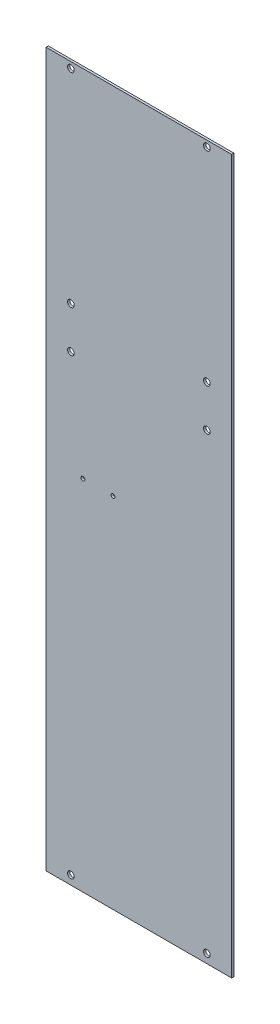
ISO-10303-21;
HEADER;
FILE_DESCRIPTION(('STEP AP214'),'2;1');
FILE_NAME('part.step','',(''),(''),'','','');
FILE_SCHEMA(('AUTOMOTIVE_DESIGN { 1 0 10303 214 1 1 1 1 }'));
ENDSEC;
DATA;
#1=APPLICATION_CONTEXT('core data for automotive mechanical design processes');
#2=APPLICATION_PROTOCOL_DEFINITION('international standard','automotive_design',2000,#1);
#3=PRODUCT_CONTEXT('',#1,'mechanical');
#4=PRODUCT('Part','Part','',(#3));
#5=PRODUCT_RELATED_PRODUCT_CATEGORY('part','',(#4));
#6=PRODUCT_DEFINITION_FORMATION('','',#4);
#7=PRODUCT_DEFINITION_CONTEXT('part definition',#1,'design');
#8=PRODUCT_DEFINITION('design','',#6,#7);
#9=PRODUCT_DEFINITION_SHAPE('','',#8);
#10=(LENGTH_UNIT() NAMED_UNIT(*) SI_UNIT(.MILLI.,.METRE.));
#11=(NAMED_UNIT(*) PLANE_ANGLE_UNIT() SI_UNIT($,.RADIAN.));
#12=(NAMED_UNIT(*) SI_UNIT($,.STERADIAN.) SOLID_ANGLE_UNIT());
#13=UNCERTAINTY_MEASURE_WITH_UNIT(LENGTH_MEASURE(1.E-05),#10,'distance_accuracy_value','');
#14=(GEOMETRIC_REPRESENTATION_CONTEXT(3) GLOBAL_UNCERTAINTY_ASSIGNED_CONTEXT((#13)) GLOBAL_UNIT_ASSIGNED_CONTEXT((#10,
#11,#12)) REPRESENTATION_CONTEXT('',''));
#15=CARTESIAN_POINT('',(0.,0.,0.));
#16=DIRECTION('',(0.,0.,1.));
#17=DIRECTION('',(1.,0.,0.));
#18=AXIS2_PLACEMENT_3D('',#15,#16,#17);
#19=CARTESIAN_POINT('',(-41.6,-160.,1.));
#20=DIRECTION('',(1.,0.,0.));
#21=DIRECTION('',(0.,0.,-1.));
#22=AXIS2_PLACEMENT_3D('',#19,#20,#21);
#23=PLANE('',#22);
#24=DIRECTION('',(0.,-1.,0.));
#25=VECTOR('',#24,1.);
#26=CARTESIAN_POINT('',(-41.6,-160.,0.));
#27=LINE('',#26,#25);
#28=CARTESIAN_POINT('',(-41.6,160.,0.));
#29=VERTEX_POINT('',#28);
#30=CARTESIAN_POINT('',(-41.6,-160.,0.));
#31=VERTEX_POINT('',#30);
#32=EDGE_CURVE('E100',#29,#31,#27,.T.);
#33=ORIENTED_EDGE('',*,*,#32,.T.);
#34=DIRECTION('',(0.,0.,-1.));
#35=VECTOR('',#34,1.);
#36=CARTESIAN_POINT('',(-41.6,-160.,1.));
#37=LINE('',#36,#35);
#38=CARTESIAN_POINT('',(-41.6,-160.,1.));
#39=VERTEX_POINT('',#38);
#40=EDGE_CURVE('E11',#39,#31,#37,.T.);
#41=ORIENTED_EDGE('',*,*,#40,.F.);
#42=DIRECTION('',(0.,-1.,0.));
#43=VECTOR('',#42,1.);
#44=CARTESIAN_POINT('',(-41.6,-160.,1.));
#45=LINE('',#44,#43);
#46=CARTESIAN_POINT('',(-41.6,160.,1.));
#47=VERTEX_POINT('',#46);
#48=EDGE_CURVE('E88',#47,#39,#45,.T.);
#49=ORIENTED_EDGE('',*,*,#48,.F.);
#50=DIRECTION('',(0.,0.,-1.));
#51=VECTOR('',#50,1.);
#52=CARTESIAN_POINT('',(-41.6,160.,1.));
#53=LINE('',#52,#51);
#54=EDGE_CURVE('E96',#47,#29,#53,.T.);
#55=ORIENTED_EDGE('',*,*,#54,.T.);
#56=EDGE_LOOP('',(#33,#41,#49,#55));
#57=FACE_BOUND('',#56,.T.);
#58=ADVANCED_FACE('F37',(#57),#23,.F.);
#59=CARTESIAN_POINT('',(41.6,-160.,1.));
#60=DIRECTION('',(0.,1.,0.));
#61=DIRECTION('',(-1.,0.,0.));
#62=AXIS2_PLACEMENT_3D('',#59,#60,#61);
#63=PLANE('',#62);
#64=DIRECTION('',(1.,0.,0.));
#65=VECTOR('',#64,1.);
#66=CARTESIAN_POINT('',(41.6,-160.,0.));
#67=LINE('',#66,#65);
#68=CARTESIAN_POINT('',(41.6,-160.,0.));
#69=VERTEX_POINT('',#68);
#70=EDGE_CURVE('E92',#31,#69,#67,.T.);
#71=ORIENTED_EDGE('',*,*,#70,.T.);
#72=DIRECTION('',(0.,0.,-1.));
#73=VECTOR('',#72,1.);
#74=CARTESIAN_POINT('',(41.6,-160.,1.));
#75=LINE('',#74,#73);
#76=CARTESIAN_POINT('',(41.6,-160.,1.));
#77=VERTEX_POINT('',#76);
#78=EDGE_CURVE('E45',#77,#69,#75,.T.);
#79=ORIENTED_EDGE('',*,*,#78,.F.);
#80=DIRECTION('',(1.,0.,0.));
#81=VECTOR('',#80,1.);
#82=CARTESIAN_POINT('',(41.6,-160.,1.));
#83=LINE('',#82,#81);
#84=EDGE_CURVE('E83',#39,#77,#83,.T.);
#85=ORIENTED_EDGE('',*,*,#84,.F.);
#86=ORIENTED_EDGE('',*,*,#40,.T.);
#87=EDGE_LOOP('',(#71,#79,#85,#86));
#88=FACE_BOUND('',#87,.T.);
#89=ADVANCED_FACE('F91',(#88),#63,.F.);
#90=CARTESIAN_POINT('',(41.6,-160.,1.));
#91=DIRECTION('',(-1.,0.,0.));
#92=DIRECTION('',(0.,0.,1.));
#93=AXIS2_PLACEMENT_3D('',#90,#91,#92);
#94=PLANE('',#93);
#95=DIRECTION('',(0.,1.,0.));
#96=VECTOR('',#95,1.);
#97=CARTESIAN_POINT('',(41.6,-160.,0.));
#98=LINE('',#97,#96);
#99=CARTESIAN_POINT('',(41.6,160.,0.));
#100=VERTEX_POINT('',#99);
#101=EDGE_CURVE('E70',#69,#100,#98,.T.);
#102=ORIENTED_EDGE('',*,*,#101,.T.);
#103=DIRECTION('',(0.,0.,-1.));
#104=VECTOR('',#103,1.);
#105=CARTESIAN_POINT('',(41.6,160.,1.));
#106=LINE('',#105,#104);
#107=CARTESIAN_POINT('',(41.6,160.,1.));
#108=VERTEX_POINT('',#107);
#109=EDGE_CURVE('E93',#108,#100,#106,.T.);
#110=ORIENTED_EDGE('',*,*,#109,.F.);
#111=DIRECTION('',(0.,1.,0.));
#112=VECTOR('',#111,1.);
#113=CARTESIAN_POINT('',(41.6,-160.,1.));
#114=LINE('',#113,#112);
#115=EDGE_CURVE('E86',#77,#108,#114,.T.);
#116=ORIENTED_EDGE('',*,*,#115,.F.);
#117=ORIENTED_EDGE('',*,*,#78,.T.);
#118=EDGE_LOOP('',(#102,#110,#116,#117));
#119=FACE_BOUND('',#118,.T.);
#120=ADVANCED_FACE('F94',(#119),#94,.F.);
#121=CARTESIAN_POINT('',(41.6,160.,1.));
#122=DIRECTION('',(0.,-1.,0.));
#123=DIRECTION('',(0.,0.,-1.));
#124=AXIS2_PLACEMENT_3D('',#121,#122,#123);
#125=PLANE('',#124);
#126=DIRECTION('',(-1.,0.,0.));
#127=VECTOR('',#126,1.);
#128=CARTESIAN_POINT('',(41.6,160.,0.));
#129=LINE('',#128,#127);
#130=EDGE_CURVE('E76',#100,#29,#129,.T.);
#131=ORIENTED_EDGE('',*,*,#130,.T.);
#132=ORIENTED_EDGE('',*,*,#54,.F.);
#133=DIRECTION('',(-1.,0.,0.));
#134=VECTOR('',#133,1.);
#135=CARTESIAN_POINT('',(41.6,160.,1.));
#136=LINE('',#135,#134);
#137=EDGE_CURVE('E53',#108,#47,#136,.T.);
#138=ORIENTED_EDGE('',*,*,#137,.F.);
#139=ORIENTED_EDGE('',*,*,#109,.T.);
#140=EDGE_LOOP('',(#131,#132,#138,#139));
#141=FACE_BOUND('',#140,.T.);
#142=ADVANCED_FACE('F108',(#141),#125,.F.);
#143=CARTESIAN_POINT('',(0.,0.,1.));
#144=DIRECTION('',(0.,0.,1.));
#145=DIRECTION('',(1.,0.,0.));
#146=AXIS2_PLACEMENT_3D('',#143,#144,#145);
#147=PLANE('',#146);
#148=CARTESIAN_POINT('',(-25.0999759143177,0.649999999999928,1.));
#149=DIRECTION('',(0.,0.,1.));
#150=DIRECTION('',(1.,0.,0.));
#151=AXIS2_PLACEMENT_3D('',#148,#149,#150);
#152=CIRCLE('',#151,0.874999999999987);
#153=CARTESIAN_POINT('',(-24.2249759143177,0.649999999999928,1.));
#154=VERTEX_POINT('',#153);
#155=EDGE_CURVE('E170',#154,#154,#152,.T.);
#156=ORIENTED_EDGE('',*,*,#155,.F.);
#157=EDGE_LOOP('',(#156));
#158=FACE_BOUND('',#157,.T.);
#159=CARTESIAN_POINT('',(-11.5999759143177,0.649999999999929,1.));
#160=DIRECTION('',(0.,0.,1.));
#161=DIRECTION('',(1.,0.,0.));
#162=AXIS2_PLACEMENT_3D('',#159,#160,#161);
#163=CIRCLE('',#162,0.874999999999987);
#164=CARTESIAN_POINT('',(-10.7249759143177,0.649999999999929,1.));
#165=VERTEX_POINT('',#164);
#166=EDGE_CURVE('E164',#165,#165,#163,.T.);
#167=ORIENTED_EDGE('',*,*,#166,.F.);
#168=EDGE_LOOP('',(#167));
#169=FACE_BOUND('',#168,.T.);
#170=CARTESIAN_POINT('',(-30.5,65.9999999999997,1.));
#171=DIRECTION('',(0.,0.,1.));
#172=DIRECTION('',(1.,0.,0.));
#173=AXIS2_PLACEMENT_3D('',#170,#171,#172);
#174=CIRCLE('',#173,1.5);
#175=CARTESIAN_POINT('',(-29.,65.9999999999997,1.));
#176=VERTEX_POINT('',#175);
#177=EDGE_CURVE('E158',#176,#176,#174,.T.);
#178=ORIENTED_EDGE('',*,*,#177,.F.);
#179=EDGE_LOOP('',(#178));
#180=FACE_BOUND('',#179,.T.);
#181=CARTESIAN_POINT('',(30.5,65.9999999999994,1.));
#182=DIRECTION('',(0.,0.,1.));
#183=DIRECTION('',(1.,0.,0.));
#184=AXIS2_PLACEMENT_3D('',#181,#182,#183);
#185=CIRCLE('',#184,1.5);
#186=CARTESIAN_POINT('',(32.,65.9999999999994,1.));
#187=VERTEX_POINT('',#186);
#188=EDGE_CURVE('E152',#187,#187,#185,.T.);
#189=ORIENTED_EDGE('',*,*,#188,.F.);
#190=EDGE_LOOP('',(#189));
#191=FACE_BOUND('',#190,.T.);
#192=CARTESIAN_POINT('',(30.5,-156.,1.));
#193=DIRECTION('',(0.,0.,1.));
#194=DIRECTION('',(1.,0.,0.));
#195=AXIS2_PLACEMENT_3D('',#192,#193,#194);
#196=CIRCLE('',#195,1.5);
#197=CARTESIAN_POINT('',(32.,-156.,1.));
#198=VERTEX_POINT('',#197);
#199=EDGE_CURVE('E146',#198,#198,#196,.T.);
#200=ORIENTED_EDGE('',*,*,#199,.F.);
#201=EDGE_LOOP('',(#200));
#202=FACE_BOUND('',#201,.T.);
#203=CARTESIAN_POINT('',(-30.5,-156.,1.));
#204=DIRECTION('',(0.,0.,1.));
#205=DIRECTION('',(1.,0.,0.));
#206=AXIS2_PLACEMENT_3D('',#203,#204,#205);
#207=CIRCLE('',#206,1.5);
#208=CARTESIAN_POINT('',(-29.,-156.,1.));
#209=VERTEX_POINT('',#208);
#210=EDGE_CURVE('E140',#209,#209,#207,.T.);
#211=ORIENTED_EDGE('',*,*,#210,.F.);
#212=EDGE_LOOP('',(#211));
#213=FACE_BOUND('',#212,.T.);
#214=CARTESIAN_POINT('',(-30.5,157.3,1.));
#215=DIRECTION('',(0.,0.,1.));
#216=DIRECTION('',(1.,0.,0.));
#217=AXIS2_PLACEMENT_3D('',#214,#215,#216);
#218=CIRCLE('',#217,1.5);
#219=CARTESIAN_POINT('',(-29.,157.3,1.));
#220=VERTEX_POINT('',#219);
#221=EDGE_CURVE('E134',#220,#220,#218,.T.);
#222=ORIENTED_EDGE('',*,*,#221,.F.);
#223=EDGE_LOOP('',(#222));
#224=FACE_BOUND('',#223,.T.);
#225=CARTESIAN_POINT('',(30.5,157.3,1.));
#226=DIRECTION('',(0.,0.,1.));
#227=DIRECTION('',(1.,0.,0.));
#228=AXIS2_PLACEMENT_3D('',#225,#226,#227);
#229=CIRCLE('',#228,1.5);
#230=CARTESIAN_POINT('',(32.,157.3,1.));
#231=VERTEX_POINT('',#230);
#232=EDGE_CURVE('E128',#231,#231,#229,.T.);
#233=ORIENTED_EDGE('',*,*,#232,.F.);
#234=EDGE_LOOP('',(#233));
#235=FACE_BOUND('',#234,.T.);
#236=CARTESIAN_POINT('',(-30.5000000000001,47.3,1.));
#237=DIRECTION('',(0.,0.,1.));
#238=DIRECTION('',(1.,0.,0.));
#239=AXIS2_PLACEMENT_3D('',#236,#237,#238);
#240=CIRCLE('',#239,1.5);
#241=CARTESIAN_POINT('',(-29.0000000000001,47.3,1.));
#242=VERTEX_POINT('',#241);
#243=EDGE_CURVE('E122',#242,#242,#240,.T.);
#244=ORIENTED_EDGE('',*,*,#243,.F.);
#245=EDGE_LOOP('',(#244));
#246=FACE_BOUND('',#245,.T.);
#247=CARTESIAN_POINT('',(30.5,47.3000000000001,1.));
#248=DIRECTION('',(0.,0.,1.));
#249=DIRECTION('',(1.,0.,0.));
#250=AXIS2_PLACEMENT_3D('',#247,#248,#249);
#251=CIRCLE('',#250,1.5);
#252=CARTESIAN_POINT('',(32.,47.3000000000001,1.));
#253=VERTEX_POINT('',#252);
#254=EDGE_CURVE('E116',#253,#253,#251,.T.);
#255=ORIENTED_EDGE('',*,*,#254,.F.);
#256=EDGE_LOOP('',(#255));
#257=FACE_BOUND('',#256,.T.);
#258=ORIENTED_EDGE('',*,*,#48,.T.);
#259=ORIENTED_EDGE('',*,*,#84,.T.);
#260=ORIENTED_EDGE('',*,*,#115,.T.);
#261=ORIENTED_EDGE('',*,*,#137,.T.);
#262=EDGE_LOOP('',(#258,#259,#260,#261));
#263=FACE_BOUND('',#262,.T.);
#264=ADVANCED_FACE('F84',(#158,#169,#180,#191,#202,#213,#224,#235,#246,#257,#263),#147,.T.);
#265=CARTESIAN_POINT('',(0.,0.,0.));
#266=DIRECTION('',(0.,0.,1.));
#267=DIRECTION('',(1.,0.,0.));
#268=AXIS2_PLACEMENT_3D('',#265,#266,#267);
#269=PLANE('',#268);
#270=CARTESIAN_POINT('',(-25.0999759143177,0.649999999999928,0.));
#271=DIRECTION('',(0.,0.,1.));
#272=DIRECTION('',(1.,0.,0.));
#273=AXIS2_PLACEMENT_3D('',#270,#271,#272);
#274=CIRCLE('',#273,0.874999999999997);
#275=CARTESIAN_POINT('',(-24.2249759143177,0.649999999999928,0.));
#276=VERTEX_POINT('',#275);
#277=EDGE_CURVE('E167',#276,#276,#274,.T.);
#278=ORIENTED_EDGE('',*,*,#277,.T.);
#279=EDGE_LOOP('',(#278));
#280=FACE_BOUND('',#279,.T.);
#281=CARTESIAN_POINT('',(-11.5999759143177,0.649999999999929,0.));
#282=DIRECTION('',(0.,0.,1.));
#283=DIRECTION('',(1.,0.,0.));
#284=AXIS2_PLACEMENT_3D('',#281,#282,#283);
#285=CIRCLE('',#284,0.874999999999999);
#286=CARTESIAN_POINT('',(-10.7249759143177,0.649999999999929,0.));
#287=VERTEX_POINT('',#286);
#288=EDGE_CURVE('E161',#287,#287,#285,.T.);
#289=ORIENTED_EDGE('',*,*,#288,.T.);
#290=EDGE_LOOP('',(#289));
#291=FACE_BOUND('',#290,.T.);
#292=CARTESIAN_POINT('',(-30.5,65.9999999999997,0.));
#293=DIRECTION('',(0.,0.,1.));
#294=DIRECTION('',(1.,0.,0.));
#295=AXIS2_PLACEMENT_3D('',#292,#293,#294);
#296=CIRCLE('',#295,1.5);
#297=CARTESIAN_POINT('',(-29.,65.9999999999997,0.));
#298=VERTEX_POINT('',#297);
#299=EDGE_CURVE('E155',#298,#298,#296,.T.);
#300=ORIENTED_EDGE('',*,*,#299,.T.);
#301=EDGE_LOOP('',(#300));
#302=FACE_BOUND('',#301,.T.);
#303=CARTESIAN_POINT('',(30.5,65.9999999999994,0.));
#304=DIRECTION('',(0.,0.,1.));
#305=DIRECTION('',(1.,0.,0.));
#306=AXIS2_PLACEMENT_3D('',#303,#304,#305);
#307=CIRCLE('',#306,1.5);
#308=CARTESIAN_POINT('',(32.,65.9999999999994,0.));
#309=VERTEX_POINT('',#308);
#310=EDGE_CURVE('E149',#309,#309,#307,.T.);
#311=ORIENTED_EDGE('',*,*,#310,.T.);
#312=EDGE_LOOP('',(#311));
#313=FACE_BOUND('',#312,.T.);
#314=CARTESIAN_POINT('',(30.5,-156.,0.));
#315=DIRECTION('',(0.,0.,1.));
#316=DIRECTION('',(1.,0.,0.));
#317=AXIS2_PLACEMENT_3D('',#314,#315,#316);
#318=CIRCLE('',#317,1.5);
#319=CARTESIAN_POINT('',(32.,-156.,0.));
#320=VERTEX_POINT('',#319);
#321=EDGE_CURVE('E143',#320,#320,#318,.T.);
#322=ORIENTED_EDGE('',*,*,#321,.T.);
#323=EDGE_LOOP('',(#322));
#324=FACE_BOUND('',#323,.T.);
#325=CARTESIAN_POINT('',(-30.5,-156.,0.));
#326=DIRECTION('',(0.,0.,1.));
#327=DIRECTION('',(1.,0.,0.));
#328=AXIS2_PLACEMENT_3D('',#325,#326,#327);
#329=CIRCLE('',#328,1.5);
#330=CARTESIAN_POINT('',(-29.,-156.,0.));
#331=VERTEX_POINT('',#330);
#332=EDGE_CURVE('E137',#331,#331,#329,.T.);
#333=ORIENTED_EDGE('',*,*,#332,.T.);
#334=EDGE_LOOP('',(#333));
#335=FACE_BOUND('',#334,.T.);
#336=CARTESIAN_POINT('',(-30.5,157.3,0.));
#337=DIRECTION('',(0.,0.,1.));
#338=DIRECTION('',(1.,0.,0.));
#339=AXIS2_PLACEMENT_3D('',#336,#337,#338);
#340=CIRCLE('',#339,1.5);
#341=CARTESIAN_POINT('',(-29.,157.3,0.));
#342=VERTEX_POINT('',#341);
#343=EDGE_CURVE('E131',#342,#342,#340,.T.);
#344=ORIENTED_EDGE('',*,*,#343,.T.);
#345=EDGE_LOOP('',(#344));
#346=FACE_BOUND('',#345,.T.);
#347=CARTESIAN_POINT('',(30.5,157.3,0.));
#348=DIRECTION('',(0.,0.,1.));
#349=DIRECTION('',(1.,0.,0.));
#350=AXIS2_PLACEMENT_3D('',#347,#348,#349);
#351=CIRCLE('',#350,1.5);
#352=CARTESIAN_POINT('',(32.,157.3,0.));
#353=VERTEX_POINT('',#352);
#354=EDGE_CURVE('E125',#353,#353,#351,.T.);
#355=ORIENTED_EDGE('',*,*,#354,.T.);
#356=EDGE_LOOP('',(#355));
#357=FACE_BOUND('',#356,.T.);
#358=CARTESIAN_POINT('',(-30.5000000000001,47.3,0.));
#359=DIRECTION('',(0.,0.,1.));
#360=DIRECTION('',(1.,0.,0.));
#361=AXIS2_PLACEMENT_3D('',#358,#359,#360);
#362=CIRCLE('',#361,1.5);
#363=CARTESIAN_POINT('',(-29.0000000000001,47.3,0.));
#364=VERTEX_POINT('',#363);
#365=EDGE_CURVE('E119',#364,#364,#362,.T.);
#366=ORIENTED_EDGE('',*,*,#365,.T.);
#367=EDGE_LOOP('',(#366));
#368=FACE_BOUND('',#367,.T.);
#369=CARTESIAN_POINT('',(30.5,47.3000000000001,0.));
#370=DIRECTION('',(0.,0.,1.));
#371=DIRECTION('',(1.,0.,0.));
#372=AXIS2_PLACEMENT_3D('',#369,#370,#371);
#373=CIRCLE('',#372,1.5);
#374=CARTESIAN_POINT('',(32.,47.3000000000001,0.));
#375=VERTEX_POINT('',#374);
#376=EDGE_CURVE('E103',#375,#375,#373,.T.);
#377=ORIENTED_EDGE('',*,*,#376,.T.);
#378=EDGE_LOOP('',(#377));
#379=FACE_BOUND('',#378,.T.);
#380=ORIENTED_EDGE('',*,*,#32,.F.);
#381=ORIENTED_EDGE('',*,*,#130,.F.);
#382=ORIENTED_EDGE('',*,*,#101,.F.);
#383=ORIENTED_EDGE('',*,*,#70,.F.);
#384=EDGE_LOOP('',(#380,#381,#382,#383));
#385=FACE_BOUND('',#384,.T.);
#386=ADVANCED_FACE('F111',(#280,#291,#302,#313,#324,#335,#346,#357,#368,#379,#385),#269,.F.);
#387=CARTESIAN_POINT('',(30.5,47.3000000000001,1.));
#388=DIRECTION('',(0.,0.,1.));
#389=DIRECTION('',(1.,0.,0.));
#390=AXIS2_PLACEMENT_3D('',#387,#388,#389);
#391=CYLINDRICAL_SURFACE('',#390,1.5);
#392=ORIENTED_EDGE('',*,*,#376,.F.);
#393=EDGE_LOOP('',(#392));
#394=FACE_BOUND('',#393,.T.);
#395=ORIENTED_EDGE('',*,*,#254,.T.);
#396=EDGE_LOOP('',(#395));
#397=FACE_BOUND('',#396,.T.);
#398=ADVANCED_FACE('F197',(#394,#397),#391,.F.);
#399=CARTESIAN_POINT('',(-30.5000000000001,47.3,1.));
#400=DIRECTION('',(0.,0.,1.));
#401=DIRECTION('',(1.,0.,0.));
#402=AXIS2_PLACEMENT_3D('',#399,#400,#401);
#403=CYLINDRICAL_SURFACE('',#402,1.5);
#404=ORIENTED_EDGE('',*,*,#365,.F.);
#405=EDGE_LOOP('',(#404));
#406=FACE_BOUND('',#405,.T.);
#407=ORIENTED_EDGE('',*,*,#243,.T.);
#408=EDGE_LOOP('',(#407));
#409=FACE_BOUND('',#408,.T.);
#410=ADVANCED_FACE('F199',(#406,#409),#403,.F.);
#411=CARTESIAN_POINT('',(30.5,157.3,1.));
#412=DIRECTION('',(0.,0.,1.));
#413=DIRECTION('',(1.,0.,0.));
#414=AXIS2_PLACEMENT_3D('',#411,#412,#413);
#415=CYLINDRICAL_SURFACE('',#414,1.5);
#416=ORIENTED_EDGE('',*,*,#354,.F.);
#417=EDGE_LOOP('',(#416));
#418=FACE_BOUND('',#417,.T.);
#419=ORIENTED_EDGE('',*,*,#232,.T.);
#420=EDGE_LOOP('',(#419));
#421=FACE_BOUND('',#420,.T.);
#422=ADVANCED_FACE('F206',(#418,#421),#415,.F.);
#423=CARTESIAN_POINT('',(-30.5,157.3,1.));
#424=DIRECTION('',(0.,0.,1.));
#425=DIRECTION('',(1.,0.,0.));
#426=AXIS2_PLACEMENT_3D('',#423,#424,#425);
#427=CYLINDRICAL_SURFACE('',#426,1.5);
#428=ORIENTED_EDGE('',*,*,#343,.F.);
#429=EDGE_LOOP('',(#428));
#430=FACE_BOUND('',#429,.T.);
#431=ORIENTED_EDGE('',*,*,#221,.T.);
#432=EDGE_LOOP('',(#431));
#433=FACE_BOUND('',#432,.T.);
#434=ADVANCED_FACE('F277',(#430,#433),#427,.F.);
#435=CARTESIAN_POINT('',(-30.5,-156.,1.));
#436=DIRECTION('',(0.,0.,1.));
#437=DIRECTION('',(1.,0.,0.));
#438=AXIS2_PLACEMENT_3D('',#435,#436,#437);
#439=CYLINDRICAL_SURFACE('',#438,1.5);
#440=ORIENTED_EDGE('',*,*,#332,.F.);
#441=EDGE_LOOP('',(#440));
#442=FACE_BOUND('',#441,.T.);
#443=ORIENTED_EDGE('',*,*,#210,.T.);
#444=EDGE_LOOP('',(#443));
#445=FACE_BOUND('',#444,.T.);
#446=ADVANCED_FACE('F273',(#442,#445),#439,.F.);
#447=CARTESIAN_POINT('',(30.5,-156.,1.));
#448=DIRECTION('',(0.,0.,1.));
#449=DIRECTION('',(1.,0.,0.));
#450=AXIS2_PLACEMENT_3D('',#447,#448,#449);
#451=CYLINDRICAL_SURFACE('',#450,1.5);
#452=ORIENTED_EDGE('',*,*,#321,.F.);
#453=EDGE_LOOP('',(#452));
#454=FACE_BOUND('',#453,.T.);
#455=ORIENTED_EDGE('',*,*,#199,.T.);
#456=EDGE_LOOP('',(#455));
#457=FACE_BOUND('',#456,.T.);
#458=ADVANCED_FACE('F269',(#454,#457),#451,.F.);
#459=CARTESIAN_POINT('',(30.5,65.9999999999994,1.));
#460=DIRECTION('',(0.,0.,1.));
#461=DIRECTION('',(1.,0.,0.));
#462=AXIS2_PLACEMENT_3D('',#459,#460,#461);
#463=CYLINDRICAL_SURFACE('',#462,1.5);
#464=ORIENTED_EDGE('',*,*,#310,.F.);
#465=EDGE_LOOP('',(#464));
#466=FACE_BOUND('',#465,.T.);
#467=ORIENTED_EDGE('',*,*,#188,.T.);
#468=EDGE_LOOP('',(#467));
#469=FACE_BOUND('',#468,.T.);
#470=ADVANCED_FACE('F265',(#466,#469),#463,.F.);
#471=CARTESIAN_POINT('',(-30.5,65.9999999999997,1.));
#472=DIRECTION('',(0.,0.,1.));
#473=DIRECTION('',(1.,0.,0.));
#474=AXIS2_PLACEMENT_3D('',#471,#472,#473);
#475=CYLINDRICAL_SURFACE('',#474,1.5);
#476=ORIENTED_EDGE('',*,*,#299,.F.);
#477=EDGE_LOOP('',(#476));
#478=FACE_BOUND('',#477,.T.);
#479=ORIENTED_EDGE('',*,*,#177,.T.);
#480=EDGE_LOOP('',(#479));
#481=FACE_BOUND('',#480,.T.);
#482=ADVANCED_FACE('F246',(#478,#481),#475,.F.);
#483=CARTESIAN_POINT('',(-11.5999759143177,0.649999999999929,1.));
#484=DIRECTION('',(0.,0.,1.));
#485=DIRECTION('',(1.,0.,0.));
#486=AXIS2_PLACEMENT_3D('',#483,#484,#485);
#487=CYLINDRICAL_SURFACE('',#486,0.874999999999993);
#488=ORIENTED_EDGE('',*,*,#288,.F.);
#489=EDGE_LOOP('',(#488));
#490=FACE_BOUND('',#489,.T.);
#491=ORIENTED_EDGE('',*,*,#166,.T.);
#492=EDGE_LOOP('',(#491));
#493=FACE_BOUND('',#492,.T.);
#494=ADVANCED_FACE('F241',(#490,#493),#487,.F.);
#495=CARTESIAN_POINT('',(-25.0999759143177,0.649999999999928,1.));
#496=DIRECTION('',(0.,0.,1.));
#497=DIRECTION('',(1.,0.,0.));
#498=AXIS2_PLACEMENT_3D('',#495,#496,#497);
#499=CYLINDRICAL_SURFACE('',#498,0.874999999999992);
#500=ORIENTED_EDGE('',*,*,#277,.F.);
#501=EDGE_LOOP('',(#500));
#502=FACE_BOUND('',#501,.T.);
#503=ORIENTED_EDGE('',*,*,#155,.T.);
#504=EDGE_LOOP('',(#503));
#505=FACE_BOUND('',#504,.T.);
#506=ADVANCED_FACE('F174',(#502,#505),#499,.F.);
#507=CLOSED_SHELL('',(#58,#89,#120,#142,#264,#386,#398,#410,#422,#434,#446,#458,#470,#482,#494,#506));
#508=MANIFOLD_SOLID_BREP('B2',#507);
#509=ADVANCED_BREP_SHAPE_REPRESENTATION('',(#18,#508),#14);
#510=SHAPE_DEFINITION_REPRESENTATION(#9,#509);
ENDSEC;
END-ISO-10303-21;
